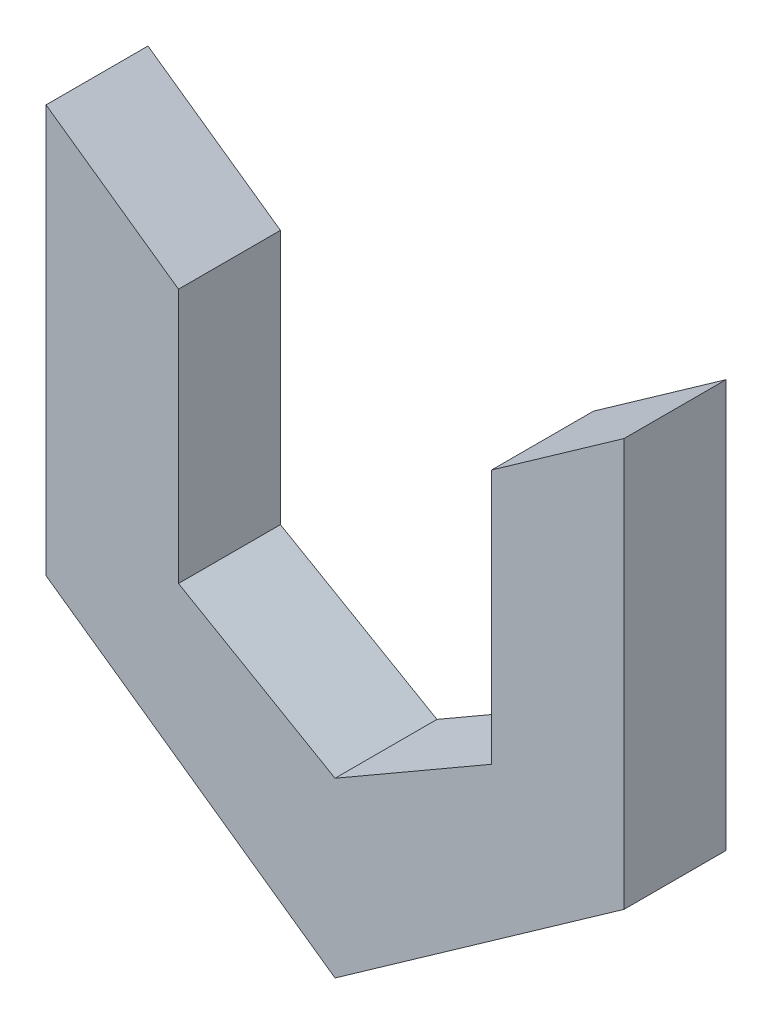
ISO-10303-21;
HEADER;
FILE_DESCRIPTION(('STEP AP214'),'2;1');
FILE_NAME('part.step','',(''),(''),'','','');
FILE_SCHEMA(('AUTOMOTIVE_DESIGN { 1 0 10303 214 1 1 1 1 }'));
ENDSEC;
DATA;
#1=APPLICATION_CONTEXT('core data for automotive mechanical design processes');
#2=APPLICATION_PROTOCOL_DEFINITION('international standard','automotive_design',2000,#1);
#3=PRODUCT_CONTEXT('',#1,'mechanical');
#4=PRODUCT('Part','Part','',(#3));
#5=PRODUCT_RELATED_PRODUCT_CATEGORY('part','',(#4));
#6=PRODUCT_DEFINITION_FORMATION('','',#4);
#7=PRODUCT_DEFINITION_CONTEXT('part definition',#1,'design');
#8=PRODUCT_DEFINITION('design','',#6,#7);
#9=PRODUCT_DEFINITION_SHAPE('','',#8);
#10=(LENGTH_UNIT() NAMED_UNIT(*) SI_UNIT(.MILLI.,.METRE.));
#11=(NAMED_UNIT(*) PLANE_ANGLE_UNIT() SI_UNIT($,.RADIAN.));
#12=(NAMED_UNIT(*) SI_UNIT($,.STERADIAN.) SOLID_ANGLE_UNIT());
#13=UNCERTAINTY_MEASURE_WITH_UNIT(LENGTH_MEASURE(1.E-05),#10,'distance_accuracy_value','');
#14=(GEOMETRIC_REPRESENTATION_CONTEXT(3) GLOBAL_UNCERTAINTY_ASSIGNED_CONTEXT((#13)) GLOBAL_UNIT_ASSIGNED_CONTEXT((#10,
#11,#12)) REPRESENTATION_CONTEXT('',''));
#15=CARTESIAN_POINT('',(0.,0.,0.));
#16=DIRECTION('',(0.,0.,1.));
#17=DIRECTION('',(1.,0.,0.));
#18=AXIS2_PLACEMENT_3D('',#15,#16,#17);
#19=CARTESIAN_POINT('',(0.,0.,10.));
#20=DIRECTION('',(-0.57650966418929,-0.817090329826728,0.));
#21=DIRECTION('',(0.817090329826729,-0.57650966418929,0.));
#22=AXIS2_PLACEMENT_3D('',#19,#20,#21);
#23=PLANE('',#22);
#24=DIRECTION('',(-0.817090329826729,0.57650966418929,0.));
#25=VECTOR('',#24,1.);
#26=CARTESIAN_POINT('',(0.,0.,0.));
#27=LINE('',#26,#25);
#28=CARTESIAN_POINT('',(12.99,-9.16527862887199,0.));
#29=VERTEX_POINT('',#28);
#30=CARTESIAN_POINT('',(0.,0.,0.));
#31=VERTEX_POINT('',#30);
#32=EDGE_CURVE('E154',#29,#31,#27,.T.);
#33=ORIENTED_EDGE('',*,*,#32,.T.);
#34=DIRECTION('',(0.,0.,-1.));
#35=VECTOR('',#34,1.);
#36=CARTESIAN_POINT('',(0.,0.,10.));
#37=LINE('',#36,#35);
#38=CARTESIAN_POINT('',(0.,0.,10.));
#39=VERTEX_POINT('',#38);
#40=EDGE_CURVE('E11',#39,#31,#37,.T.);
#41=ORIENTED_EDGE('',*,*,#40,.F.);
#42=DIRECTION('',(-0.817090329826729,0.57650966418929,0.));
#43=VECTOR('',#42,1.);
#44=CARTESIAN_POINT('',(0.,0.,10.));
#45=LINE('',#44,#43);
#46=CARTESIAN_POINT('',(12.99,-9.16527862887199,10.));
#47=VERTEX_POINT('',#46);
#48=EDGE_CURVE('E182',#47,#39,#45,.T.);
#49=ORIENTED_EDGE('',*,*,#48,.F.);
#50=DIRECTION('',(0.,0.,-1.));
#51=VECTOR('',#50,1.);
#52=CARTESIAN_POINT('',(12.99,-9.16527862887199,10.));
#53=LINE('',#52,#51);
#54=EDGE_CURVE('E150',#47,#29,#53,.T.);
#55=ORIENTED_EDGE('',*,*,#54,.T.);
#56=EDGE_LOOP('',(#33,#41,#49,#55));
#57=FACE_BOUND('',#56,.T.);
#58=ADVANCED_FACE('F41',(#57),#23,.F.);
#59=CARTESIAN_POINT('',(0.,0.,10.));
#60=DIRECTION('',(1.,0.,0.));
#61=DIRECTION('',(0.,0.,-1.));
#62=AXIS2_PLACEMENT_3D('',#59,#60,#61);
#63=PLANE('',#62);
#64=DIRECTION('',(0.,-1.,0.));
#65=VECTOR('',#64,1.);
#66=CARTESIAN_POINT('',(0.,0.,0.));
#67=LINE('',#66,#65);
#68=CARTESIAN_POINT('',(0.,-40.,0.));
#69=VERTEX_POINT('',#68);
#70=EDGE_CURVE('E158',#31,#69,#67,.T.);
#71=ORIENTED_EDGE('',*,*,#70,.T.);
#72=DIRECTION('',(0.,0.,-1.));
#73=VECTOR('',#72,1.);
#74=CARTESIAN_POINT('',(0.,-40.,10.));
#75=LINE('',#74,#73);
#76=CARTESIAN_POINT('',(0.,-40.,10.));
#77=VERTEX_POINT('',#76);
#78=EDGE_CURVE('E50',#77,#69,#75,.T.);
#79=ORIENTED_EDGE('',*,*,#78,.F.);
#80=DIRECTION('',(0.,-1.,0.));
#81=VECTOR('',#80,1.);
#82=CARTESIAN_POINT('',(0.,0.,10.));
#83=LINE('',#82,#81);
#84=EDGE_CURVE('E107',#39,#77,#83,.T.);
#85=ORIENTED_EDGE('',*,*,#84,.F.);
#86=ORIENTED_EDGE('',*,*,#40,.T.);
#87=EDGE_LOOP('',(#71,#79,#85,#86));
#88=FACE_BOUND('',#87,.T.);
#89=ADVANCED_FACE('F246',(#88),#63,.F.);
#90=CARTESIAN_POINT('',(0.,-40.,10.));
#91=DIRECTION('',(0.576509664189289,0.817090329826729,0.));
#92=DIRECTION('',(-0.817090329826729,0.576509664189289,0.));
#93=AXIS2_PLACEMENT_3D('',#90,#91,#92);
#94=PLANE('',#93);
#95=DIRECTION('',(0.817090329826729,-0.576509664189289,0.));
#96=VECTOR('',#95,1.);
#97=CARTESIAN_POINT('',(0.,-40.,0.));
#98=LINE('',#97,#96);
#99=CARTESIAN_POINT('',(28.3461104151915,-60.,0.));
#100=VERTEX_POINT('',#99);
#101=EDGE_CURVE('E161',#69,#100,#98,.T.);
#102=ORIENTED_EDGE('',*,*,#101,.T.);
#103=DIRECTION('',(0.,0.,-1.));
#104=VECTOR('',#103,1.);
#105=CARTESIAN_POINT('',(28.3461104151915,-60.,10.));
#106=LINE('',#105,#104);
#107=CARTESIAN_POINT('',(28.3461104151915,-60.,10.));
#108=VERTEX_POINT('',#107);
#109=EDGE_CURVE('E201',#108,#100,#106,.T.);
#110=ORIENTED_EDGE('',*,*,#109,.F.);
#111=DIRECTION('',(0.817090329826729,-0.576509664189289,0.));
#112=VECTOR('',#111,1.);
#113=CARTESIAN_POINT('',(0.,-40.,10.));
#114=LINE('',#113,#112);
#115=EDGE_CURVE('E211',#77,#108,#114,.T.);
#116=ORIENTED_EDGE('',*,*,#115,.F.);
#117=ORIENTED_EDGE('',*,*,#78,.T.);
#118=EDGE_LOOP('',(#102,#110,#116,#117));
#119=FACE_BOUND('',#118,.T.);
#120=ADVANCED_FACE('F209',(#119),#94,.F.);
#121=CARTESIAN_POINT('',(56.6922208303829,-40.,10.));
#122=DIRECTION('',(-0.576509664189289,0.817090329826729,0.));
#123=DIRECTION('',(-0.817090329826729,-0.57650966418929,0.));
#124=AXIS2_PLACEMENT_3D('',#121,#122,#123);
#125=PLANE('',#124);
#126=DIRECTION('',(0.817090329826729,0.576509664189289,0.));
#127=VECTOR('',#126,1.);
#128=CARTESIAN_POINT('',(56.6922208303829,-40.,0.));
#129=LINE('',#128,#127);
#130=CARTESIAN_POINT('',(56.6922208303829,-40.,0.));
#131=VERTEX_POINT('',#130);
#132=EDGE_CURVE('E164',#100,#131,#129,.T.);
#133=ORIENTED_EDGE('',*,*,#132,.T.);
#134=DIRECTION('',(0.,0.,-1.));
#135=VECTOR('',#134,1.);
#136=CARTESIAN_POINT('',(56.6922208303829,-40.,10.));
#137=LINE('',#136,#135);
#138=CARTESIAN_POINT('',(56.6922208303829,-40.,10.));
#139=VERTEX_POINT('',#138);
#140=EDGE_CURVE('E197',#139,#131,#137,.T.);
#141=ORIENTED_EDGE('',*,*,#140,.F.);
#142=DIRECTION('',(0.817090329826729,0.576509664189289,0.));
#143=VECTOR('',#142,1.);
#144=CARTESIAN_POINT('',(56.6922208303829,-40.,10.));
#145=LINE('',#144,#143);
#146=EDGE_CURVE('E230',#108,#139,#145,.T.);
#147=ORIENTED_EDGE('',*,*,#146,.F.);
#148=ORIENTED_EDGE('',*,*,#109,.T.);
#149=EDGE_LOOP('',(#133,#141,#147,#148));
#150=FACE_BOUND('',#149,.T.);
#151=ADVANCED_FACE('F220',(#150),#125,.F.);
#152=CARTESIAN_POINT('',(56.6922208303829,0.,10.));
#153=DIRECTION('',(-1.,0.,0.));
#154=DIRECTION('',(0.,0.,1.));
#155=AXIS2_PLACEMENT_3D('',#152,#153,#154);
#156=PLANE('',#155);
#157=DIRECTION('',(0.,1.,0.));
#158=VECTOR('',#157,1.);
#159=CARTESIAN_POINT('',(56.6922208303829,0.,0.));
#160=LINE('',#159,#158);
#161=CARTESIAN_POINT('',(56.6922208303829,0.,0.));
#162=VERTEX_POINT('',#161);
#163=EDGE_CURVE('E167',#131,#162,#160,.T.);
#164=ORIENTED_EDGE('',*,*,#163,.T.);
#165=DIRECTION('',(0.,0.,-1.));
#166=VECTOR('',#165,1.);
#167=CARTESIAN_POINT('',(56.6922208303829,0.,10.));
#168=LINE('',#167,#166);
#169=CARTESIAN_POINT('',(56.6922208303829,0.,10.));
#170=VERTEX_POINT('',#169);
#171=EDGE_CURVE('E193',#170,#162,#168,.T.);
#172=ORIENTED_EDGE('',*,*,#171,.F.);
#173=DIRECTION('',(0.,1.,0.));
#174=VECTOR('',#173,1.);
#175=CARTESIAN_POINT('',(56.6922208303829,0.,10.));
#176=LINE('',#175,#174);
#177=EDGE_CURVE('E226',#139,#170,#176,.T.);
#178=ORIENTED_EDGE('',*,*,#177,.F.);
#179=ORIENTED_EDGE('',*,*,#140,.T.);
#180=EDGE_LOOP('',(#164,#172,#178,#179));
#181=FACE_BOUND('',#180,.T.);
#182=ADVANCED_FACE('F224',(#181),#156,.F.);
#183=CARTESIAN_POINT('',(56.6922208303829,0.,10.));
#184=DIRECTION('',(0.57650966418929,-0.817090329826729,0.));
#185=DIRECTION('',(0.817090329826729,0.57650966418929,0.));
#186=AXIS2_PLACEMENT_3D('',#183,#184,#185);
#187=PLANE('',#186);
#188=DIRECTION('',(-0.817090329826729,-0.57650966418929,0.));
#189=VECTOR('',#188,1.);
#190=CARTESIAN_POINT('',(56.6922208303829,0.,0.));
#191=LINE('',#190,#189);
#192=CARTESIAN_POINT('',(43.7022208303829,-9.16527862887199,0.));
#193=VERTEX_POINT('',#192);
#194=EDGE_CURVE('E170',#162,#193,#191,.T.);
#195=ORIENTED_EDGE('',*,*,#194,.T.);
#196=DIRECTION('',(0.,0.,-1.));
#197=VECTOR('',#196,1.);
#198=CARTESIAN_POINT('',(43.7022208303829,-9.16527862887199,10.));
#199=LINE('',#198,#197);
#200=CARTESIAN_POINT('',(43.7022208303829,-9.16527862887199,10.));
#201=VERTEX_POINT('',#200);
#202=EDGE_CURVE('E189',#201,#193,#199,.T.);
#203=ORIENTED_EDGE('',*,*,#202,.F.);
#204=DIRECTION('',(-0.817090329826729,-0.57650966418929,0.));
#205=VECTOR('',#204,1.);
#206=CARTESIAN_POINT('',(56.6922208303829,0.,10.));
#207=LINE('',#206,#205);
#208=EDGE_CURVE('E229',#170,#201,#207,.T.);
#209=ORIENTED_EDGE('',*,*,#208,.F.);
#210=ORIENTED_EDGE('',*,*,#171,.T.);
#211=EDGE_LOOP('',(#195,#203,#209,#210));
#212=FACE_BOUND('',#211,.T.);
#213=ADVANCED_FACE('F258',(#212),#187,.F.);
#214=CARTESIAN_POINT('',(43.7022208303829,-9.16527862887199,10.));
#215=DIRECTION('',(1.,0.,0.));
#216=DIRECTION('',(0.,0.,-1.));
#217=AXIS2_PLACEMENT_3D('',#214,#215,#216);
#218=PLANE('',#217);
#219=DIRECTION('',(0.,-1.,0.));
#220=VECTOR('',#219,1.);
#221=CARTESIAN_POINT('',(43.7022208303829,-9.16527862887199,0.));
#222=LINE('',#221,#220);
#223=CARTESIAN_POINT('',(43.7022208303829,-34.165278628872,0.));
#224=VERTEX_POINT('',#223);
#225=EDGE_CURVE('E173',#193,#224,#222,.T.);
#226=ORIENTED_EDGE('',*,*,#225,.T.);
#227=DIRECTION('',(0.,0.,-1.));
#228=VECTOR('',#227,1.);
#229=CARTESIAN_POINT('',(43.7022208303829,-34.165278628872,10.));
#230=LINE('',#229,#228);
#231=CARTESIAN_POINT('',(43.7022208303829,-34.165278628872,10.));
#232=VERTEX_POINT('',#231);
#233=EDGE_CURVE('E143',#232,#224,#230,.T.);
#234=ORIENTED_EDGE('',*,*,#233,.F.);
#235=DIRECTION('',(0.,-1.,0.));
#236=VECTOR('',#235,1.);
#237=CARTESIAN_POINT('',(43.7022208303829,-9.16527862887199,10.));
#238=LINE('',#237,#236);
#239=EDGE_CURVE('E132',#201,#232,#238,.T.);
#240=ORIENTED_EDGE('',*,*,#239,.F.);
#241=ORIENTED_EDGE('',*,*,#202,.T.);
#242=EDGE_LOOP('',(#226,#234,#240,#241));
#243=FACE_BOUND('',#242,.T.);
#244=ADVANCED_FACE('F261',(#243),#218,.F.);
#245=CARTESIAN_POINT('',(43.7022208303829,-34.165278628872,10.));
#246=DIRECTION('',(0.499999999999997,-0.866025403784441,0.));
#247=DIRECTION('',(0.866025403784441,0.499999999999997,0.));
#248=AXIS2_PLACEMENT_3D('',#245,#246,#247);
#249=PLANE('',#248);
#250=DIRECTION('',(-0.866025403784441,-0.499999999999997,0.));
#251=VECTOR('',#250,1.);
#252=CARTESIAN_POINT('',(43.7022208303829,-34.165278628872,0.));
#253=LINE('',#252,#251);
#254=CARTESIAN_POINT('',(28.3461104151915,-43.0311331107883,0.));
#255=VERTEX_POINT('',#254);
#256=EDGE_CURVE('E141',#224,#255,#253,.T.);
#257=ORIENTED_EDGE('',*,*,#256,.T.);
#258=DIRECTION('',(0.,0.,-1.));
#259=VECTOR('',#258,1.);
#260=CARTESIAN_POINT('',(28.3461104151915,-43.0311331107883,10.));
#261=LINE('',#260,#259);
#262=CARTESIAN_POINT('',(28.3461104151915,-43.0311331107883,10.));
#263=VERTEX_POINT('',#262);
#264=EDGE_CURVE('E138',#263,#255,#261,.T.);
#265=ORIENTED_EDGE('',*,*,#264,.F.);
#266=DIRECTION('',(-0.866025403784441,-0.499999999999997,0.));
#267=VECTOR('',#266,1.);
#268=CARTESIAN_POINT('',(43.7022208303829,-34.165278628872,10.));
#269=LINE('',#268,#267);
#270=EDGE_CURVE('E126',#232,#263,#269,.T.);
#271=ORIENTED_EDGE('',*,*,#270,.F.);
#272=ORIENTED_EDGE('',*,*,#233,.T.);
#273=EDGE_LOOP('',(#257,#265,#271,#272));
#274=FACE_BOUND('',#273,.T.);
#275=ADVANCED_FACE('F139',(#274),#249,.F.);
#276=CARTESIAN_POINT('',(12.99,-34.165278628872,10.));
#277=DIRECTION('',(-0.499999999999997,-0.866025403784441,0.));
#278=DIRECTION('',(0.866025403784441,-0.499999999999997,0.));
#279=AXIS2_PLACEMENT_3D('',#276,#277,#278);
#280=PLANE('',#279);
#281=DIRECTION('',(-0.866025403784441,0.499999999999997,0.));
#282=VECTOR('',#281,1.);
#283=CARTESIAN_POINT('',(12.99,-34.165278628872,0.));
#284=LINE('',#283,#282);
#285=CARTESIAN_POINT('',(12.99,-34.165278628872,0.));
#286=VERTEX_POINT('',#285);
#287=EDGE_CURVE('E93',#255,#286,#284,.T.);
#288=ORIENTED_EDGE('',*,*,#287,.T.);
#289=DIRECTION('',(0.,0.,-1.));
#290=VECTOR('',#289,1.);
#291=CARTESIAN_POINT('',(12.99,-34.165278628872,10.));
#292=LINE('',#291,#290);
#293=CARTESIAN_POINT('',(12.99,-34.165278628872,10.));
#294=VERTEX_POINT('',#293);
#295=EDGE_CURVE('E144',#294,#286,#292,.T.);
#296=ORIENTED_EDGE('',*,*,#295,.F.);
#297=DIRECTION('',(-0.866025403784441,0.499999999999997,0.));
#298=VECTOR('',#297,1.);
#299=CARTESIAN_POINT('',(12.99,-34.165278628872,10.));
#300=LINE('',#299,#298);
#301=EDGE_CURVE('E130',#263,#294,#300,.T.);
#302=ORIENTED_EDGE('',*,*,#301,.F.);
#303=ORIENTED_EDGE('',*,*,#264,.T.);
#304=EDGE_LOOP('',(#288,#296,#302,#303));
#305=FACE_BOUND('',#304,.T.);
#306=ADVANCED_FACE('F146',(#305),#280,.F.);
#307=CARTESIAN_POINT('',(12.99,-9.16527862887199,10.));
#308=DIRECTION('',(-1.,0.,0.));
#309=DIRECTION('',(0.,-1.,0.));
#310=AXIS2_PLACEMENT_3D('',#307,#308,#309);
#311=PLANE('',#310);
#312=DIRECTION('',(0.,1.,0.));
#313=VECTOR('',#312,1.);
#314=CARTESIAN_POINT('',(12.99,-9.16527862887199,0.));
#315=LINE('',#314,#313);
#316=EDGE_CURVE('E99',#286,#29,#315,.T.);
#317=ORIENTED_EDGE('',*,*,#316,.T.);
#318=ORIENTED_EDGE('',*,*,#54,.F.);
#319=DIRECTION('',(0.,1.,0.));
#320=VECTOR('',#319,1.);
#321=CARTESIAN_POINT('',(12.99,-9.16527862887199,10.));
#322=LINE('',#321,#320);
#323=EDGE_CURVE('E58',#294,#47,#322,.T.);
#324=ORIENTED_EDGE('',*,*,#323,.F.);
#325=ORIENTED_EDGE('',*,*,#295,.T.);
#326=EDGE_LOOP('',(#317,#318,#324,#325));
#327=FACE_BOUND('',#326,.T.);
#328=ADVANCED_FACE('F270',(#327),#311,.F.);
#329=CARTESIAN_POINT('',(0.,0.,10.));
#330=DIRECTION('',(0.,0.,-1.));
#331=DIRECTION('',(-1.,0.,0.));
#332=AXIS2_PLACEMENT_3D('',#329,#330,#331);
#333=PLANE('',#332);
#334=ORIENTED_EDGE('',*,*,#48,.T.);
#335=ORIENTED_EDGE('',*,*,#84,.T.);
#336=ORIENTED_EDGE('',*,*,#115,.T.);
#337=ORIENTED_EDGE('',*,*,#146,.T.);
#338=ORIENTED_EDGE('',*,*,#177,.T.);
#339=ORIENTED_EDGE('',*,*,#208,.T.);
#340=ORIENTED_EDGE('',*,*,#239,.T.);
#341=ORIENTED_EDGE('',*,*,#270,.T.);
#342=ORIENTED_EDGE('',*,*,#301,.T.);
#343=ORIENTED_EDGE('',*,*,#323,.T.);
#344=EDGE_LOOP('',(#334,#335,#336,#337,#338,#339,#340,#341,#342,#343));
#345=FACE_BOUND('',#344,.T.);
#346=ADVANCED_FACE('F128',(#345),#333,.F.);
#347=CARTESIAN_POINT('',(0.,0.,0.));
#348=DIRECTION('',(0.,0.,-1.));
#349=DIRECTION('',(-1.,0.,0.));
#350=AXIS2_PLACEMENT_3D('',#347,#348,#349);
#351=PLANE('',#350);
#352=ORIENTED_EDGE('',*,*,#32,.F.);
#353=ORIENTED_EDGE('',*,*,#316,.F.);
#354=ORIENTED_EDGE('',*,*,#287,.F.);
#355=ORIENTED_EDGE('',*,*,#256,.F.);
#356=ORIENTED_EDGE('',*,*,#225,.F.);
#357=ORIENTED_EDGE('',*,*,#194,.F.);
#358=ORIENTED_EDGE('',*,*,#163,.F.);
#359=ORIENTED_EDGE('',*,*,#132,.F.);
#360=ORIENTED_EDGE('',*,*,#101,.F.);
#361=ORIENTED_EDGE('',*,*,#70,.F.);
#362=EDGE_LOOP('',(#352,#353,#354,#355,#356,#357,#358,#359,#360,#361));
#363=FACE_BOUND('',#362,.T.);
#364=ADVANCED_FACE('F215',(#363),#351,.T.);
#365=CLOSED_SHELL('',(#58,#89,#120,#151,#182,#213,#244,#275,#306,#328,#346,#364));
#366=MANIFOLD_SOLID_BREP('B2',#365);
#367=ADVANCED_BREP_SHAPE_REPRESENTATION('',(#18,#366),#14);
#368=SHAPE_DEFINITION_REPRESENTATION(#9,#367);
ENDSEC;
END-ISO-10303-21;
